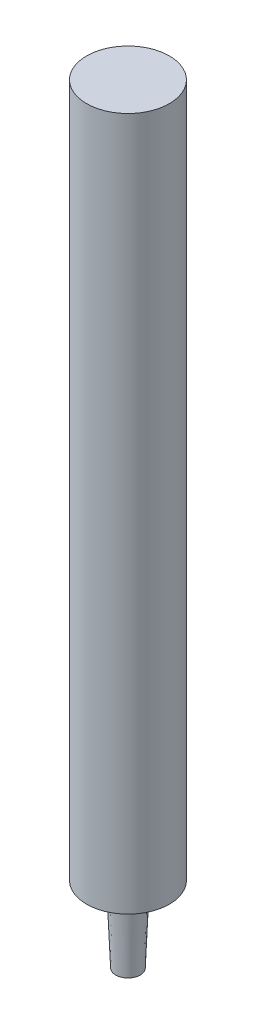
ISO-10303-21;
HEADER;
FILE_DESCRIPTION(('STEP AP214'),'2;1');
FILE_NAME('part.step','',(''),(''),'','','');
FILE_SCHEMA(('AUTOMOTIVE_DESIGN { 1 0 10303 214 1 1 1 1 }'));
ENDSEC;
DATA;
#1=APPLICATION_CONTEXT('core data for automotive mechanical design processes');
#2=APPLICATION_PROTOCOL_DEFINITION('international standard','automotive_design',2000,#1);
#3=PRODUCT_CONTEXT('',#1,'mechanical');
#4=PRODUCT('Part','Part','',(#3));
#5=PRODUCT_RELATED_PRODUCT_CATEGORY('part','',(#4));
#6=PRODUCT_DEFINITION_FORMATION('','',#4);
#7=PRODUCT_DEFINITION_CONTEXT('part definition',#1,'design');
#8=PRODUCT_DEFINITION('design','',#6,#7);
#9=PRODUCT_DEFINITION_SHAPE('','',#8);
#10=(LENGTH_UNIT() NAMED_UNIT(*) SI_UNIT(.MILLI.,.METRE.));
#11=(NAMED_UNIT(*) PLANE_ANGLE_UNIT() SI_UNIT($,.RADIAN.));
#12=(NAMED_UNIT(*) SI_UNIT($,.STERADIAN.) SOLID_ANGLE_UNIT());
#13=UNCERTAINTY_MEASURE_WITH_UNIT(LENGTH_MEASURE(1.E-05),#10,'distance_accuracy_value','');
#14=(GEOMETRIC_REPRESENTATION_CONTEXT(3) GLOBAL_UNCERTAINTY_ASSIGNED_CONTEXT((#13)) GLOBAL_UNIT_ASSIGNED_CONTEXT((#10,
#11,#12)) REPRESENTATION_CONTEXT('',''));
#15=CARTESIAN_POINT('',(0.,0.,0.));
#16=DIRECTION('',(0.,0.,1.));
#17=DIRECTION('',(1.,0.,0.));
#18=AXIS2_PLACEMENT_3D('',#15,#16,#17);
#19=CARTESIAN_POINT('',(0.,-61.105,0.));
#20=DIRECTION('',(0.,1.,0.));
#21=DIRECTION('',(0.,0.,1.));
#22=AXIS2_PLACEMENT_3D('',#19,#20,#21);
#23=PLANE('',#22);
#24=CARTESIAN_POINT('',(0.,-61.105,0.));
#25=DIRECTION('',(0.,1.,0.));
#26=DIRECTION('',(0.,0.,1.));
#27=AXIS2_PLACEMENT_3D('',#24,#25,#26);
#28=CIRCLE('',#27,2.94);
#29=CARTESIAN_POINT('',(0.,-61.105,2.94));
#30=VERTEX_POINT('',#29);
#31=EDGE_CURVE('E10',#30,#30,#28,.T.);
#32=ORIENTED_EDGE('',*,*,#31,.F.);
#33=EDGE_LOOP('',(#32));
#34=FACE_BOUND('',#33,.T.);
#35=ADVANCED_FACE('F43',(#34),#23,.F.);
#36=CARTESIAN_POINT('',(0.,-46.8135,0.));
#37=DIRECTION('',(0.,1.,0.));
#38=DIRECTION('',(0.,0.,1.));
#39=AXIS2_PLACEMENT_3D('',#36,#37,#38);
#40=CONICAL_SURFACE('',#39,3.5175,0.0403866621750545);
#41=CARTESIAN_POINT('',(0.,-46.8135,0.));
#42=DIRECTION('',(0.,1.,0.));
#43=DIRECTION('',(0.,0.,1.));
#44=AXIS2_PLACEMENT_3D('',#41,#42,#43);
#45=CIRCLE('',#44,3.5175);
#46=CARTESIAN_POINT('',(0.,-46.8135,3.5175));
#47=VERTEX_POINT('',#46);
#48=EDGE_CURVE('E52',#47,#47,#45,.T.);
#49=ORIENTED_EDGE('',*,*,#48,.F.);
#50=EDGE_LOOP('',(#49));
#51=FACE_BOUND('',#50,.T.);
#52=ORIENTED_EDGE('',*,*,#31,.T.);
#53=EDGE_LOOP('',(#52));
#54=FACE_BOUND('',#53,.T.);
#55=ADVANCED_FACE('F76',(#51,#54),#40,.T.);
#56=CARTESIAN_POINT('',(0.,-42.925,0.));
#57=DIRECTION('',(0.,1.,0.));
#58=DIRECTION('',(-1.,0.,0.));
#59=AXIS2_PLACEMENT_3D('',#56,#57,#58);
#60=CONICAL_SURFACE('',#59,9.912,1.02444170211805);
#61=CARTESIAN_POINT('',(0.,-42.925,0.));
#62=DIRECTION('',(0.,1.,0.));
#63=DIRECTION('',(0.,0.,1.));
#64=AXIS2_PLACEMENT_3D('',#61,#62,#63);
#65=CIRCLE('',#64,9.912);
#66=CARTESIAN_POINT('',(0.,-42.925,9.912));
#67=VERTEX_POINT('',#66);
#68=EDGE_CURVE('E58',#67,#67,#65,.T.);
#69=ORIENTED_EDGE('',*,*,#68,.F.);
#70=EDGE_LOOP('',(#69));
#71=FACE_BOUND('',#70,.T.);
#72=ORIENTED_EDGE('',*,*,#48,.T.);
#73=EDGE_LOOP('',(#72));
#74=FACE_BOUND('',#73,.T.);
#75=ADVANCED_FACE('F71',(#71,#74),#60,.T.);
#76=CARTESIAN_POINT('',(0.,61.105,0.));
#77=DIRECTION('',(0.,1.,0.));
#78=DIRECTION('',(0.,0.,1.));
#79=AXIS2_PLACEMENT_3D('',#76,#77,#78);
#80=CYLINDRICAL_SURFACE('',#79,9.912);
#81=ORIENTED_EDGE('',*,*,#68,.T.);
#82=EDGE_LOOP('',(#81));
#83=FACE_BOUND('',#82,.T.);
#84=CARTESIAN_POINT('',(0.,123.22,0.));
#85=DIRECTION('',(0.,1.,0.));
#86=DIRECTION('',(0.,0.,1.));
#87=AXIS2_PLACEMENT_3D('',#84,#85,#86);
#88=CIRCLE('',#87,9.912);
#89=CARTESIAN_POINT('',(0.,123.22,9.912));
#90=VERTEX_POINT('',#89);
#91=EDGE_CURVE('E47',#90,#90,#88,.T.);
#92=ORIENTED_EDGE('',*,*,#91,.F.);
#93=EDGE_LOOP('',(#92));
#94=FACE_BOUND('',#93,.T.);
#95=ADVANCED_FACE('F69',(#83,#94),#80,.T.);
#96=CARTESIAN_POINT('',(0.,123.22,0.));
#97=DIRECTION('',(0.,1.,0.));
#98=DIRECTION('',(0.,0.,1.));
#99=AXIS2_PLACEMENT_3D('',#96,#97,#98);
#100=PLANE('',#99);
#101=ORIENTED_EDGE('',*,*,#91,.T.);
#102=EDGE_LOOP('',(#101));
#103=FACE_BOUND('',#102,.T.);
#104=ADVANCED_FACE('F45',(#103),#100,.T.);
#105=CLOSED_SHELL('',(#35,#55,#75,#95,#104));
#106=MANIFOLD_SOLID_BREP('B2',#105);
#107=ADVANCED_BREP_SHAPE_REPRESENTATION('',(#18,#106),#14);
#108=SHAPE_DEFINITION_REPRESENTATION(#9,#107);
ENDSEC;
END-ISO-10303-21;
